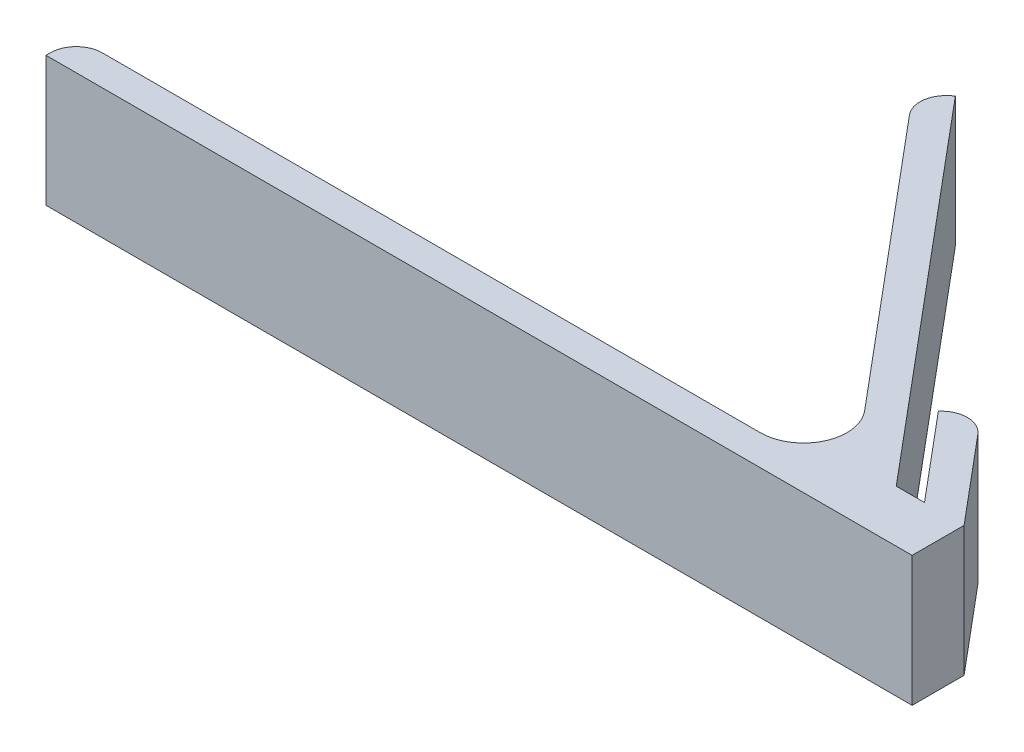
ISO-10303-21;
HEADER;
FILE_DESCRIPTION(('STEP AP214'),'2;1');
FILE_NAME('part.step','',(''),(''),'','','');
FILE_SCHEMA(('AUTOMOTIVE_DESIGN { 1 0 10303 214 1 1 1 1 }'));
ENDSEC;
DATA;
#1=APPLICATION_CONTEXT('core data for automotive mechanical design processes');
#2=APPLICATION_PROTOCOL_DEFINITION('international standard','automotive_design',2000,#1);
#3=PRODUCT_CONTEXT('',#1,'mechanical');
#4=PRODUCT('Part','Part','',(#3));
#5=PRODUCT_RELATED_PRODUCT_CATEGORY('part','',(#4));
#6=PRODUCT_DEFINITION_FORMATION('','',#4);
#7=PRODUCT_DEFINITION_CONTEXT('part definition',#1,'design');
#8=PRODUCT_DEFINITION('design','',#6,#7);
#9=PRODUCT_DEFINITION_SHAPE('','',#8);
#10=(LENGTH_UNIT() NAMED_UNIT(*) SI_UNIT(.MILLI.,.METRE.));
#11=(NAMED_UNIT(*) PLANE_ANGLE_UNIT() SI_UNIT($,.RADIAN.));
#12=(NAMED_UNIT(*) SI_UNIT($,.STERADIAN.) SOLID_ANGLE_UNIT());
#13=UNCERTAINTY_MEASURE_WITH_UNIT(LENGTH_MEASURE(1.E-05),#10,'distance_accuracy_value','');
#14=(GEOMETRIC_REPRESENTATION_CONTEXT(3) GLOBAL_UNCERTAINTY_ASSIGNED_CONTEXT((#13)) GLOBAL_UNIT_ASSIGNED_CONTEXT((#10,
#11,#12)) REPRESENTATION_CONTEXT('',''));
#15=CARTESIAN_POINT('',(0.,0.,0.));
#16=DIRECTION('',(0.,0.,1.));
#17=DIRECTION('',(1.,0.,0.));
#18=AXIS2_PLACEMENT_3D('',#15,#16,#17);
#19=CARTESIAN_POINT('',(-43.4402194426441,15.,-48.4356946226896));
#20=DIRECTION('',(0.642787609686534,0.,0.766044443118982));
#21=DIRECTION('',(0.766044443118982,0.,-0.642787609686534));
#22=AXIS2_PLACEMENT_3D('',#19,#20,#21);
#23=PLANE('',#22);
#24=DIRECTION('',(-0.766044443118982,0.,0.642787609686534));
#25=VECTOR('',#24,1.);
#26=CARTESIAN_POINT('',(-43.4402194426441,0.,-48.4356946226896));
#27=LINE('',#26,#25);
#28=CARTESIAN_POINT('',(-43.4402194426441,0.,-48.4356946226896));
#29=VERTEX_POINT('',#28);
#30=CARTESIAN_POINT('',(-43.8232416642036,0.,-48.1143008178463));
#31=VERTEX_POINT('',#30);
#32=EDGE_CURVE('E188',#29,#31,#27,.T.);
#33=ORIENTED_EDGE('',*,*,#32,.T.);
#34=DIRECTION('',(0.,-1.,0.));
#35=VECTOR('',#34,1.);
#36=CARTESIAN_POINT('',(-43.8232416642036,15.,-48.1143008178463));
#37=LINE('',#36,#35);
#38=CARTESIAN_POINT('',(-43.8232416642036,15.,-48.1143008178463));
#39=VERTEX_POINT('',#38);
#40=EDGE_CURVE('E250',#31,#39,#37,.F.);
#41=ORIENTED_EDGE('',*,*,#40,.T.);
#42=DIRECTION('',(-0.766044443118982,0.,0.642787609686534));
#43=VECTOR('',#42,1.);
#44=CARTESIAN_POINT('',(-43.4402194426441,15.,-48.4356946226896));
#45=LINE('',#44,#43);
#46=CARTESIAN_POINT('',(-43.4402194426441,15.,-48.4356946226896));
#47=VERTEX_POINT('',#46);
#48=EDGE_CURVE('E151',#47,#39,#45,.T.);
#49=ORIENTED_EDGE('',*,*,#48,.F.);
#50=DIRECTION('',(0.,-1.,0.));
#51=VECTOR('',#50,1.);
#52=CARTESIAN_POINT('',(-43.4402194426441,15.,-48.4356946226896));
#53=LINE('',#52,#51);
#54=EDGE_CURVE('E187',#47,#29,#53,.T.);
#55=ORIENTED_EDGE('',*,*,#54,.T.);
#56=EDGE_LOOP('',(#33,#41,#49,#55));
#57=FACE_BOUND('',#56,.T.);
#58=ADVANCED_FACE('F33',(#57),#23,.F.);
#59=CARTESIAN_POINT('',(-46.1213749935606,15.,-46.1859379887867));
#60=DIRECTION('',(0.766044443118979,0.,-0.642787609686538));
#61=DIRECTION('',(-0.642787609686538,0.,-0.766044443118979));
#62=AXIS2_PLACEMENT_3D('',#59,#60,#61);
#63=PLANE('',#62);
#64=DIRECTION('',(0.642787609686538,0.,0.766044443118979));
#65=VECTOR('',#64,1.);
#66=CARTESIAN_POINT('',(-46.1213749935606,15.,-46.1859379887867));
#67=LINE('',#66,#65);
#68=CARTESIAN_POINT('',(-44.193012164501,15.,-43.8878046594298));
#69=VERTEX_POINT('',#68);
#70=CARTESIAN_POINT('',(-17.1959325576664,15.,-11.7139380484327));
#71=VERTEX_POINT('',#70);
#72=EDGE_CURVE('E138',#69,#71,#67,.T.);
#73=ORIENTED_EDGE('',*,*,#72,.F.);
#74=DIRECTION('',(0.,-1.,0.));
#75=VECTOR('',#74,1.);
#76=CARTESIAN_POINT('',(-44.193012164501,15.,-43.8878046594298));
#77=LINE('',#76,#75);
#78=CARTESIAN_POINT('',(-44.193012164501,0.,-43.8878046594298));
#79=VERTEX_POINT('',#78);
#80=EDGE_CURVE('E248',#69,#79,#77,.T.);
#81=ORIENTED_EDGE('',*,*,#80,.T.);
#82=DIRECTION('',(0.642787609686538,0.,0.766044443118979));
#83=VECTOR('',#82,1.);
#84=CARTESIAN_POINT('',(-46.1213749935606,0.,-46.1859379887867));
#85=LINE('',#84,#83);
#86=CARTESIAN_POINT('',(-17.1959325576664,0.,-11.7139380484327));
#87=VERTEX_POINT('',#86);
#88=EDGE_CURVE('E157',#79,#87,#85,.T.);
#89=ORIENTED_EDGE('',*,*,#88,.T.);
#90=DIRECTION('',(0.,-1.,0.));
#91=VECTOR('',#90,1.);
#92=CARTESIAN_POINT('',(-17.1959325576664,15.,-11.7139380484327));
#93=LINE('',#92,#91);
#94=EDGE_CURVE('E154',#71,#87,#93,.T.);
#95=ORIENTED_EDGE('',*,*,#94,.F.);
#96=EDGE_LOOP('',(#73,#81,#89,#95));
#97=FACE_BOUND('',#96,.T.);
#98=ADVANCED_FACE('F155',(#97),#63,.F.);
#99=CARTESIAN_POINT('',(-21.0261547732612,15.,-8.50000000000001));
#100=DIRECTION('',(0.,-1.,0.));
#101=DIRECTION('',(0.,0.,-1.));
#102=AXIS2_PLACEMENT_3D('',#99,#100,#101);
#103=CYLINDRICAL_SURFACE('',#102,4.99999999999999);
#104=CARTESIAN_POINT('',(-21.0261547732612,0.,-8.50000000000001));
#105=DIRECTION('',(0.,-1.,0.));
#106=DIRECTION('',(0.,0.,1.));
#107=AXIS2_PLACEMENT_3D('',#104,#105,#106);
#108=CIRCLE('',#107,4.99999999999999);
#109=CARTESIAN_POINT('',(-21.0261547732612,0.,-3.50000000000002));
#110=VERTEX_POINT('',#109);
#111=EDGE_CURVE('E192',#87,#110,#108,.T.);
#112=ORIENTED_EDGE('',*,*,#111,.T.);
#113=DIRECTION('',(0.,-1.,0.));
#114=VECTOR('',#113,1.);
#115=CARTESIAN_POINT('',(-21.0261547732612,15.,-3.50000000000002));
#116=LINE('',#115,#114);
#117=CARTESIAN_POINT('',(-21.0261547732612,15.,-3.50000000000002));
#118=VERTEX_POINT('',#117);
#119=EDGE_CURVE('E161',#118,#110,#116,.T.);
#120=ORIENTED_EDGE('',*,*,#119,.F.);
#121=CARTESIAN_POINT('',(-21.0261547732612,15.,-8.50000000000001));
#122=DIRECTION('',(0.,-1.,0.));
#123=DIRECTION('',(0.,0.,1.));
#124=AXIS2_PLACEMENT_3D('',#121,#122,#123);
#125=CIRCLE('',#124,4.99999999999999);
#126=EDGE_CURVE('E143',#71,#118,#125,.T.);
#127=ORIENTED_EDGE('',*,*,#126,.F.);
#128=ORIENTED_EDGE('',*,*,#94,.T.);
#129=EDGE_LOOP('',(#112,#120,#127,#128));
#130=FACE_BOUND('',#129,.T.);
#131=ADVANCED_FACE('F163',(#130),#103,.F.);
#132=CARTESIAN_POINT('',(-21.0261547732612,15.,-3.5));
#133=DIRECTION('',(0.,0.,1.));
#134=DIRECTION('',(1.,0.,0.));
#135=AXIS2_PLACEMENT_3D('',#132,#133,#134);
#136=PLANE('',#135);
#137=DIRECTION('',(-1.,0.,0.));
#138=VECTOR('',#137,1.);
#139=CARTESIAN_POINT('',(-21.0261547732612,0.,-3.5));
#140=LINE('',#139,#138);
#141=CARTESIAN_POINT('',(-97.,0.,-3.5));
#142=VERTEX_POINT('',#141);
#143=EDGE_CURVE('E194',#110,#142,#140,.T.);
#144=ORIENTED_EDGE('',*,*,#143,.T.);
#145=DIRECTION('',(0.,-1.,0.));
#146=VECTOR('',#145,1.);
#147=CARTESIAN_POINT('',(-97.,15.,-3.5));
#148=LINE('',#147,#146);
#149=CARTESIAN_POINT('',(-97.,15.,-3.5));
#150=VERTEX_POINT('',#149);
#151=EDGE_CURVE('E242',#142,#150,#148,.F.);
#152=ORIENTED_EDGE('',*,*,#151,.T.);
#153=DIRECTION('',(-1.,0.,0.));
#154=VECTOR('',#153,1.);
#155=CARTESIAN_POINT('',(-21.0261547732612,15.,-3.5));
#156=LINE('',#155,#154);
#157=EDGE_CURVE('E166',#118,#150,#156,.T.);
#158=ORIENTED_EDGE('',*,*,#157,.F.);
#159=ORIENTED_EDGE('',*,*,#119,.T.);
#160=EDGE_LOOP('',(#144,#152,#158,#159));
#161=FACE_BOUND('',#160,.T.);
#162=ADVANCED_FACE('F285',(#161),#136,.F.);
#163=CARTESIAN_POINT('',(-100.,15.,-3.5));
#164=DIRECTION('',(1.,0.,0.));
#165=DIRECTION('',(0.,0.,-1.));
#166=AXIS2_PLACEMENT_3D('',#163,#164,#165);
#167=PLANE('',#166);
#168=DIRECTION('',(0.,0.,1.));
#169=VECTOR('',#168,1.);
#170=CARTESIAN_POINT('',(-100.,15.,-3.5));
#171=LINE('',#170,#169);
#172=CARTESIAN_POINT('',(-100.,15.,-0.5));
#173=VERTEX_POINT('',#172);
#174=CARTESIAN_POINT('',(-100.,15.,0.));
#175=VERTEX_POINT('',#174);
#176=EDGE_CURVE('E168',#173,#175,#171,.T.);
#177=ORIENTED_EDGE('',*,*,#176,.F.);
#178=DIRECTION('',(0.,-1.,0.));
#179=VECTOR('',#178,1.);
#180=CARTESIAN_POINT('',(-100.,15.,-0.5));
#181=LINE('',#180,#179);
#182=CARTESIAN_POINT('',(-100.,0.,-0.5));
#183=VERTEX_POINT('',#182);
#184=EDGE_CURVE('E160',#173,#183,#181,.T.);
#185=ORIENTED_EDGE('',*,*,#184,.T.);
#186=DIRECTION('',(0.,0.,1.));
#187=VECTOR('',#186,1.);
#188=CARTESIAN_POINT('',(-100.,0.,-3.5));
#189=LINE('',#188,#187);
#190=CARTESIAN_POINT('',(-100.,0.,0.));
#191=VERTEX_POINT('',#190);
#192=EDGE_CURVE('E197',#183,#191,#189,.T.);
#193=ORIENTED_EDGE('',*,*,#192,.T.);
#194=DIRECTION('',(0.,-1.,0.));
#195=VECTOR('',#194,1.);
#196=CARTESIAN_POINT('',(-100.,15.,0.));
#197=LINE('',#196,#195);
#198=EDGE_CURVE('E230',#175,#191,#197,.T.);
#199=ORIENTED_EDGE('',*,*,#198,.F.);
#200=EDGE_LOOP('',(#177,#185,#193,#199));
#201=FACE_BOUND('',#200,.T.);
#202=ADVANCED_FACE('F293',(#201),#167,.F.);
#203=CARTESIAN_POINT('',(-100.,15.,0.));
#204=DIRECTION('',(0.,0.,-1.));
#205=DIRECTION('',(-1.,0.,0.));
#206=AXIS2_PLACEMENT_3D('',#203,#204,#205);
#207=PLANE('',#206);
#208=DIRECTION('',(1.,0.,0.));
#209=VECTOR('',#208,1.);
#210=CARTESIAN_POINT('',(-100.,0.,0.));
#211=LINE('',#210,#209);
#212=CARTESIAN_POINT('',(0.,0.,0.));
#213=VERTEX_POINT('',#212);
#214=EDGE_CURVE('E199',#191,#213,#211,.T.);
#215=ORIENTED_EDGE('',*,*,#214,.T.);
#216=DIRECTION('',(0.,-1.,0.));
#217=VECTOR('',#216,1.);
#218=CARTESIAN_POINT('',(0.,15.,0.));
#219=LINE('',#218,#217);
#220=CARTESIAN_POINT('',(0.,15.,0.));
#221=VERTEX_POINT('',#220);
#222=EDGE_CURVE('E227',#221,#213,#219,.T.);
#223=ORIENTED_EDGE('',*,*,#222,.F.);
#224=DIRECTION('',(1.,0.,0.));
#225=VECTOR('',#224,1.);
#226=CARTESIAN_POINT('',(-100.,15.,0.));
#227=LINE('',#226,#225);
#228=EDGE_CURVE('E173',#175,#221,#227,.T.);
#229=ORIENTED_EDGE('',*,*,#228,.F.);
#230=ORIENTED_EDGE('',*,*,#198,.T.);
#231=EDGE_LOOP('',(#215,#223,#229,#230));
#232=FACE_BOUND('',#231,.T.);
#233=ADVANCED_FACE('F299',(#232),#207,.F.);
#234=CARTESIAN_POINT('',(0.,15.,0.));
#235=DIRECTION('',(-1.,0.,0.));
#236=DIRECTION('',(0.,0.,1.));
#237=AXIS2_PLACEMENT_3D('',#234,#235,#236);
#238=PLANE('',#237);
#239=DIRECTION('',(0.,0.,-1.));
#240=VECTOR('',#239,1.);
#241=CARTESIAN_POINT('',(0.,0.,0.));
#242=LINE('',#241,#240);
#243=CARTESIAN_POINT('',(0.,0.,-6.00000000000001));
#244=VERTEX_POINT('',#243);
#245=EDGE_CURVE('E201',#213,#244,#242,.T.);
#246=ORIENTED_EDGE('',*,*,#245,.T.);
#247=DIRECTION('',(0.,-1.,0.));
#248=VECTOR('',#247,1.);
#249=CARTESIAN_POINT('',(0.,15.,-6.00000000000001));
#250=LINE('',#249,#248);
#251=CARTESIAN_POINT('',(0.,15.,-6.00000000000001));
#252=VERTEX_POINT('',#251);
#253=EDGE_CURVE('E224',#252,#244,#250,.T.);
#254=ORIENTED_EDGE('',*,*,#253,.F.);
#255=DIRECTION('',(0.,0.,-1.));
#256=VECTOR('',#255,1.);
#257=CARTESIAN_POINT('',(0.,15.,0.));
#258=LINE('',#257,#256);
#259=EDGE_CURVE('E175',#221,#252,#258,.T.);
#260=ORIENTED_EDGE('',*,*,#259,.F.);
#261=ORIENTED_EDGE('',*,*,#222,.T.);
#262=EDGE_LOOP('',(#246,#254,#260,#261));
#263=FACE_BOUND('',#262,.T.);
#264=ADVANCED_FACE('F303',(#263),#238,.F.);
#265=CARTESIAN_POINT('',(0.,15.,-6.00000000000001));
#266=DIRECTION('',(-0.766044443118979,0.,0.642787609686538));
#267=DIRECTION('',(0.642787609686538,0.,0.766044443118979));
#268=AXIS2_PLACEMENT_3D('',#265,#266,#267);
#269=PLANE('',#268);
#270=DIRECTION('',(-0.642787609686538,0.,-0.766044443118979));
#271=VECTOR('',#270,1.);
#272=CARTESIAN_POINT('',(0.,0.,-6.00000000000001));
#273=LINE('',#272,#271);
#274=CARTESIAN_POINT('',(-8.31564605861193,0.,-15.9102010650927));
#275=VERTEX_POINT('',#274);
#276=EDGE_CURVE('E203',#244,#275,#273,.T.);
#277=ORIENTED_EDGE('',*,*,#276,.T.);
#278=DIRECTION('',(0.,-1.,0.));
#279=VECTOR('',#278,1.);
#280=CARTESIAN_POINT('',(-8.31564605861193,15.,-15.9102010650927));
#281=LINE('',#280,#279);
#282=CARTESIAN_POINT('',(-8.31564605861193,15.,-15.9102010650927));
#283=VERTEX_POINT('',#282);
#284=EDGE_CURVE('E11',#275,#283,#281,.F.);
#285=ORIENTED_EDGE('',*,*,#284,.T.);
#286=DIRECTION('',(-0.642787609686538,0.,-0.766044443118979));
#287=VECTOR('',#286,1.);
#288=CARTESIAN_POINT('',(0.,15.,-6.00000000000001));
#289=LINE('',#288,#287);
#290=EDGE_CURVE('E177',#252,#283,#289,.T.);
#291=ORIENTED_EDGE('',*,*,#290,.F.);
#292=ORIENTED_EDGE('',*,*,#253,.T.);
#293=EDGE_LOOP('',(#277,#285,#291,#292));
#294=FACE_BOUND('',#293,.T.);
#295=ADVANCED_FACE('F335',(#294),#269,.F.);
#296=CARTESIAN_POINT('',(-10.2440088876715,15.,-18.2083343944496));
#297=DIRECTION('',(0.642787609686539,0.,0.766044443118978));
#298=DIRECTION('',(0.766044443118978,0.,-0.642787609686539));
#299=AXIS2_PLACEMENT_3D('',#296,#297,#298);
#300=PLANE('',#299);
#301=DIRECTION('',(-0.766044443118978,0.,0.642787609686539));
#302=VECTOR('',#301,1.);
#303=CARTESIAN_POINT('',(-10.2440088876715,15.,-18.2083343944496));
#304=LINE('',#303,#302);
#305=CARTESIAN_POINT('',(-12.5421422170285,15.,-16.27997156539));
#306=VERTEX_POINT('',#305);
#307=CARTESIAN_POINT('',(-12.925164438588,15.,-15.9585777605467));
#308=VERTEX_POINT('',#307);
#309=EDGE_CURVE('E179',#306,#308,#304,.T.);
#310=ORIENTED_EDGE('',*,*,#309,.F.);
#311=DIRECTION('',(0.,-1.,0.));
#312=VECTOR('',#311,1.);
#313=CARTESIAN_POINT('',(-12.5421422170285,15.,-16.27997156539));
#314=LINE('',#313,#312);
#315=CARTESIAN_POINT('',(-12.5421422170285,0.,-16.27997156539));
#316=VERTEX_POINT('',#315);
#317=EDGE_CURVE('E41',#306,#316,#314,.T.);
#318=ORIENTED_EDGE('',*,*,#317,.T.);
#319=DIRECTION('',(-0.766044443118978,0.,0.642787609686539));
#320=VECTOR('',#319,1.);
#321=CARTESIAN_POINT('',(-10.2440088876715,0.,-18.2083343944496));
#322=LINE('',#321,#320);
#323=CARTESIAN_POINT('',(-12.925164438588,0.,-15.9585777605467));
#324=VERTEX_POINT('',#323);
#325=EDGE_CURVE('E205',#316,#324,#322,.T.);
#326=ORIENTED_EDGE('',*,*,#325,.T.);
#327=DIRECTION('',(0.,-1.,0.));
#328=VECTOR('',#327,1.);
#329=CARTESIAN_POINT('',(-12.925164438588,15.,-15.9585777605467));
#330=LINE('',#329,#328);
#331=EDGE_CURVE('E221',#308,#324,#330,.T.);
#332=ORIENTED_EDGE('',*,*,#331,.F.);
#333=EDGE_LOOP('',(#310,#318,#326,#332));
#334=FACE_BOUND('',#333,.T.);
#335=ADVANCED_FACE('F255',(#334),#300,.F.);
#336=CARTESIAN_POINT('',(-12.925164438588,15.,-15.9585777605467));
#337=DIRECTION('',(0.766044443118978,0.,-0.642787609686539));
#338=DIRECTION('',(-0.642787609686539,0.,-0.766044443118978));
#339=AXIS2_PLACEMENT_3D('',#336,#337,#338);
#340=PLANE('',#339);
#341=DIRECTION('',(0.642787609686539,0.,0.766044443118978));
#342=VECTOR('',#341,1.);
#343=CARTESIAN_POINT('',(-12.925164438588,0.,-15.9585777605467));
#344=LINE('',#343,#342);
#345=CARTESIAN_POINT('',(-4.56892551266295,0.,-6.));
#346=VERTEX_POINT('',#345);
#347=EDGE_CURVE('E207',#324,#346,#344,.T.);
#348=ORIENTED_EDGE('',*,*,#347,.T.);
#349=DIRECTION('',(0.,-1.,0.));
#350=VECTOR('',#349,1.);
#351=CARTESIAN_POINT('',(-4.56892551266295,15.,-6.));
#352=LINE('',#351,#350);
#353=CARTESIAN_POINT('',(-4.56892551266295,15.,-6.));
#354=VERTEX_POINT('',#353);
#355=EDGE_CURVE('E218',#354,#346,#352,.T.);
#356=ORIENTED_EDGE('',*,*,#355,.F.);
#357=DIRECTION('',(0.642787609686539,0.,0.766044443118978));
#358=VECTOR('',#357,1.);
#359=CARTESIAN_POINT('',(-12.925164438588,15.,-15.9585777605467));
#360=LINE('',#359,#358);
#361=EDGE_CURVE('E181',#308,#354,#360,.T.);
#362=ORIENTED_EDGE('',*,*,#361,.F.);
#363=ORIENTED_EDGE('',*,*,#331,.T.);
#364=EDGE_LOOP('',(#348,#356,#362,#363));
#365=FACE_BOUND('',#364,.T.);
#366=ADVANCED_FACE('F267',(#365),#340,.F.);
#367=CARTESIAN_POINT('',(-4.56892551266295,15.,-6.));
#368=DIRECTION('',(0.,0.,1.));
#369=DIRECTION('',(1.,0.,0.));
#370=AXIS2_PLACEMENT_3D('',#367,#368,#369);
#371=PLANE('',#370);
#372=DIRECTION('',(-1.,0.,0.));
#373=VECTOR('',#372,1.);
#374=CARTESIAN_POINT('',(-4.56892551266295,0.,-6.));
#375=LINE('',#374,#373);
#376=CARTESIAN_POINT('',(-7.83244373599366,0.,-6.00000000000001));
#377=VERTEX_POINT('',#376);
#378=EDGE_CURVE('E209',#346,#377,#375,.T.);
#379=ORIENTED_EDGE('',*,*,#378,.T.);
#380=DIRECTION('',(0.,-1.,0.));
#381=VECTOR('',#380,1.);
#382=CARTESIAN_POINT('',(-7.83244373599366,15.,-6.00000000000001));
#383=LINE('',#382,#381);
#384=CARTESIAN_POINT('',(-7.83244373599366,15.,-6.00000000000001));
#385=VERTEX_POINT('',#384);
#386=EDGE_CURVE('E215',#385,#377,#383,.T.);
#387=ORIENTED_EDGE('',*,*,#386,.F.);
#388=DIRECTION('',(-1.,0.,0.));
#389=VECTOR('',#388,1.);
#390=CARTESIAN_POINT('',(-4.56892551266295,15.,-6.));
#391=LINE('',#390,#389);
#392=EDGE_CURVE('E183',#354,#385,#391,.T.);
#393=ORIENTED_EDGE('',*,*,#392,.F.);
#394=ORIENTED_EDGE('',*,*,#355,.T.);
#395=EDGE_LOOP('',(#379,#387,#393,#394));
#396=FACE_BOUND('',#395,.T.);
#397=ADVANCED_FACE('F271',(#396),#371,.F.);
#398=CARTESIAN_POINT('',(-7.83244373599366,15.,-6.00000000000001));
#399=DIRECTION('',(-0.766044443118978,0.,0.642787609686539));
#400=DIRECTION('',(0.642787609686539,0.,0.766044443118979));
#401=AXIS2_PLACEMENT_3D('',#398,#399,#400);
#402=PLANE('',#401);
#403=DIRECTION('',(-0.642787609686539,0.,-0.766044443118978));
#404=VECTOR('',#403,1.);
#405=CARTESIAN_POINT('',(-7.83244373599366,0.,-6.00000000000001));
#406=LINE('',#405,#404);
#407=EDGE_CURVE('E211',#377,#29,#406,.T.);
#408=ORIENTED_EDGE('',*,*,#407,.T.);
#409=ORIENTED_EDGE('',*,*,#54,.F.);
#410=DIRECTION('',(-0.642787609686539,0.,-0.766044443118978));
#411=VECTOR('',#410,1.);
#412=CARTESIAN_POINT('',(-7.83244373599366,15.,-6.00000000000001));
#413=LINE('',#412,#411);
#414=EDGE_CURVE('E185',#385,#47,#413,.T.);
#415=ORIENTED_EDGE('',*,*,#414,.F.);
#416=ORIENTED_EDGE('',*,*,#386,.T.);
#417=EDGE_LOOP('',(#408,#409,#415,#416));
#418=FACE_BOUND('',#417,.T.);
#419=ADVANCED_FACE('F277',(#418),#402,.F.);
#420=CARTESIAN_POINT('',(-21.0261547732612,15.,-8.50000000000001));
#421=DIRECTION('',(0.,1.,0.));
#422=DIRECTION('',(0.,0.,1.));
#423=AXIS2_PLACEMENT_3D('',#420,#421,#422);
#424=PLANE('',#423);
#425=ORIENTED_EDGE('',*,*,#157,.T.);
#426=CARTESIAN_POINT('',(-97.,15.,-0.5));
#427=DIRECTION('',(0.,1.,0.));
#428=DIRECTION('',(0.,0.,1.));
#429=AXIS2_PLACEMENT_3D('',#426,#427,#428);
#430=CIRCLE('',#429,3.);
#431=EDGE_CURVE('E246',#150,#173,#430,.T.);
#432=ORIENTED_EDGE('',*,*,#431,.T.);
#433=ORIENTED_EDGE('',*,*,#176,.T.);
#434=ORIENTED_EDGE('',*,*,#228,.T.);
#435=ORIENTED_EDGE('',*,*,#259,.T.);
#436=ORIENTED_EDGE('',*,*,#290,.T.);
#437=CARTESIAN_POINT('',(-10.6137793879689,15.,-13.9818382360331));
#438=DIRECTION('',(0.,1.,0.));
#439=DIRECTION('',(0.,0.,1.));
#440=AXIS2_PLACEMENT_3D('',#437,#438,#439);
#441=CIRCLE('',#440,3.);
#442=EDGE_CURVE('E48',#283,#306,#441,.T.);
#443=ORIENTED_EDGE('',*,*,#442,.T.);
#444=ORIENTED_EDGE('',*,*,#309,.T.);
#445=ORIENTED_EDGE('',*,*,#361,.T.);
#446=ORIENTED_EDGE('',*,*,#392,.T.);
#447=ORIENTED_EDGE('',*,*,#414,.T.);
#448=ORIENTED_EDGE('',*,*,#48,.T.);
#449=CARTESIAN_POINT('',(-41.894878835144,15.,-45.8161674884894));
#450=DIRECTION('',(0.,1.,0.));
#451=DIRECTION('',(0.,0.,1.));
#452=AXIS2_PLACEMENT_3D('',#449,#450,#451);
#453=CIRCLE('',#452,3.);
#454=EDGE_CURVE('E147',#39,#69,#453,.T.);
#455=ORIENTED_EDGE('',*,*,#454,.T.);
#456=ORIENTED_EDGE('',*,*,#72,.T.);
#457=ORIENTED_EDGE('',*,*,#126,.T.);
#458=EDGE_LOOP('',(#425,#432,#433,#434,#435,#436,#443,#444,#445,#446,#447,#448,#455,#456,#457));
#459=FACE_BOUND('',#458,.T.);
#460=ADVANCED_FACE('F141',(#459),#424,.T.);
#461=CARTESIAN_POINT('',(-21.0261547732612,0.,-8.50000000000001));
#462=DIRECTION('',(0.,1.,0.));
#463=DIRECTION('',(0.,0.,1.));
#464=AXIS2_PLACEMENT_3D('',#461,#462,#463);
#465=PLANE('',#464);
#466=ORIENTED_EDGE('',*,*,#192,.F.);
#467=CARTESIAN_POINT('',(-97.,0.,-0.5));
#468=DIRECTION('',(0.,1.,0.));
#469=DIRECTION('',(0.,0.,1.));
#470=AXIS2_PLACEMENT_3D('',#467,#468,#469);
#471=CIRCLE('',#470,3.);
#472=EDGE_CURVE('E240',#183,#142,#471,.F.);
#473=ORIENTED_EDGE('',*,*,#472,.T.);
#474=ORIENTED_EDGE('',*,*,#143,.F.);
#475=ORIENTED_EDGE('',*,*,#111,.F.);
#476=ORIENTED_EDGE('',*,*,#88,.F.);
#477=CARTESIAN_POINT('',(-41.894878835144,0.,-45.8161674884894));
#478=DIRECTION('',(0.,1.,0.));
#479=DIRECTION('',(0.,0.,1.));
#480=AXIS2_PLACEMENT_3D('',#477,#478,#479);
#481=CIRCLE('',#480,3.);
#482=EDGE_CURVE('E238',#79,#31,#481,.F.);
#483=ORIENTED_EDGE('',*,*,#482,.T.);
#484=ORIENTED_EDGE('',*,*,#32,.F.);
#485=ORIENTED_EDGE('',*,*,#407,.F.);
#486=ORIENTED_EDGE('',*,*,#378,.F.);
#487=ORIENTED_EDGE('',*,*,#347,.F.);
#488=ORIENTED_EDGE('',*,*,#325,.F.);
#489=CARTESIAN_POINT('',(-10.6137793879689,0.,-13.9818382360331));
#490=DIRECTION('',(0.,1.,0.));
#491=DIRECTION('',(0.,0.,1.));
#492=AXIS2_PLACEMENT_3D('',#489,#490,#491);
#493=CIRCLE('',#492,3.);
#494=EDGE_CURVE('E236',#316,#275,#493,.F.);
#495=ORIENTED_EDGE('',*,*,#494,.T.);
#496=ORIENTED_EDGE('',*,*,#276,.F.);
#497=ORIENTED_EDGE('',*,*,#245,.F.);
#498=ORIENTED_EDGE('',*,*,#214,.F.);
#499=EDGE_LOOP('',(#466,#473,#474,#475,#476,#483,#484,#485,#486,#487,#488,#495,#496,#497,#498));
#500=FACE_BOUND('',#499,.T.);
#501=ADVANCED_FACE('F261',(#500),#465,.F.);
#502=CARTESIAN_POINT('',(-97.,15.,-0.5));
#503=DIRECTION('',(0.,-1.,0.));
#504=DIRECTION('',(0.,0.,-1.));
#505=AXIS2_PLACEMENT_3D('',#502,#503,#504);
#506=CYLINDRICAL_SURFACE('',#505,3.);
#507=ORIENTED_EDGE('',*,*,#431,.F.);
#508=ORIENTED_EDGE('',*,*,#151,.F.);
#509=ORIENTED_EDGE('',*,*,#472,.F.);
#510=ORIENTED_EDGE('',*,*,#184,.F.);
#511=EDGE_LOOP('',(#507,#508,#509,#510));
#512=FACE_BOUND('',#511,.T.);
#513=ADVANCED_FACE('F291',(#512),#506,.T.);
#514=CARTESIAN_POINT('',(-41.894878835144,15.,-45.8161674884894));
#515=DIRECTION('',(0.,-1.,0.));
#516=DIRECTION('',(0.,0.,-1.));
#517=AXIS2_PLACEMENT_3D('',#514,#515,#516);
#518=CYLINDRICAL_SURFACE('',#517,3.);
#519=ORIENTED_EDGE('',*,*,#454,.F.);
#520=ORIENTED_EDGE('',*,*,#40,.F.);
#521=ORIENTED_EDGE('',*,*,#482,.F.);
#522=ORIENTED_EDGE('',*,*,#80,.F.);
#523=EDGE_LOOP('',(#519,#520,#521,#522));
#524=FACE_BOUND('',#523,.T.);
#525=ADVANCED_FACE('F282',(#524),#518,.T.);
#526=CARTESIAN_POINT('',(-10.6137793879689,15.,-13.9818382360331));
#527=DIRECTION('',(0.,-1.,0.));
#528=DIRECTION('',(0.,0.,-1.));
#529=AXIS2_PLACEMENT_3D('',#526,#527,#528);
#530=CYLINDRICAL_SURFACE('',#529,3.);
#531=ORIENTED_EDGE('',*,*,#442,.F.);
#532=ORIENTED_EDGE('',*,*,#284,.F.);
#533=ORIENTED_EDGE('',*,*,#494,.F.);
#534=ORIENTED_EDGE('',*,*,#317,.F.);
#535=EDGE_LOOP('',(#531,#532,#533,#534));
#536=FACE_BOUND('',#535,.T.);
#537=ADVANCED_FACE('F35',(#536),#530,.T.);
#538=CLOSED_SHELL('',(#58,#98,#131,#162,#202,#233,#264,#295,#335,#366,#397,#419,#460,#501,#513,
#525,#537));
#539=MANIFOLD_SOLID_BREP('B2',#538);
#540=ADVANCED_BREP_SHAPE_REPRESENTATION('',(#18,#539),#14);
#541=SHAPE_DEFINITION_REPRESENTATION(#9,#540);
ENDSEC;
END-ISO-10303-21;
